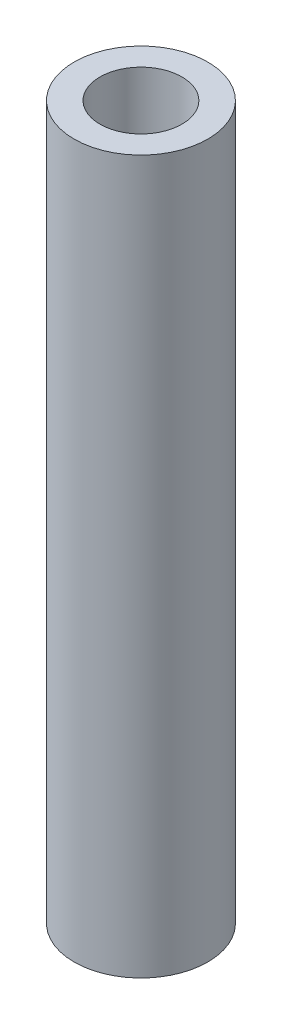
ISO-10303-21;
HEADER;
FILE_DESCRIPTION(('STEP AP214'),'2;1');
FILE_NAME('part.step','',(''),(''),'','','');
FILE_SCHEMA(('AUTOMOTIVE_DESIGN { 1 0 10303 214 1 1 1 1 }'));
ENDSEC;
DATA;
#1=APPLICATION_CONTEXT('core data for automotive mechanical design processes');
#2=APPLICATION_PROTOCOL_DEFINITION('international standard','automotive_design',2000,#1);
#3=PRODUCT_CONTEXT('',#1,'mechanical');
#4=PRODUCT('Part','Part','',(#3));
#5=PRODUCT_RELATED_PRODUCT_CATEGORY('part','',(#4));
#6=PRODUCT_DEFINITION_FORMATION('','',#4);
#7=PRODUCT_DEFINITION_CONTEXT('part definition',#1,'design');
#8=PRODUCT_DEFINITION('design','',#6,#7);
#9=PRODUCT_DEFINITION_SHAPE('','',#8);
#10=(LENGTH_UNIT() NAMED_UNIT(*) SI_UNIT(.MILLI.,.METRE.));
#11=(NAMED_UNIT(*) PLANE_ANGLE_UNIT() SI_UNIT($,.RADIAN.));
#12=(NAMED_UNIT(*) SI_UNIT($,.STERADIAN.) SOLID_ANGLE_UNIT());
#13=UNCERTAINTY_MEASURE_WITH_UNIT(LENGTH_MEASURE(1.E-05),#10,'distance_accuracy_value','');
#14=(GEOMETRIC_REPRESENTATION_CONTEXT(3) GLOBAL_UNCERTAINTY_ASSIGNED_CONTEXT((#13)) GLOBAL_UNIT_ASSIGNED_CONTEXT((#10,
#11,#12)) REPRESENTATION_CONTEXT('',''));
#15=CARTESIAN_POINT('',(0.,0.,0.));
#16=DIRECTION('',(0.,0.,1.));
#17=DIRECTION('',(1.,0.,0.));
#18=AXIS2_PLACEMENT_3D('',#15,#16,#17);
#19=CARTESIAN_POINT('',(0.,25.4,0.));
#20=DIRECTION('',(0.,1.,0.));
#21=DIRECTION('',(0.,0.,1.));
#22=AXIS2_PLACEMENT_3D('',#19,#20,#21);
#23=PLANE('',#22);
#24=CARTESIAN_POINT('',(0.,25.4,0.));
#25=DIRECTION('',(0.,1.,0.));
#26=DIRECTION('',(0.,0.,1.));
#27=AXIS2_PLACEMENT_3D('',#24,#25,#26);
#28=CIRCLE('',#27,2.38125);
#29=CARTESIAN_POINT('',(0.,25.4,2.38125));
#30=VERTEX_POINT('',#29);
#31=EDGE_CURVE('E10',#30,#30,#28,.T.);
#32=ORIENTED_EDGE('',*,*,#31,.T.);
#33=EDGE_LOOP('',(#32));
#34=FACE_BOUND('',#33,.T.);
#35=CARTESIAN_POINT('',(0.,25.4,0.));
#36=DIRECTION('',(0.,1.,0.));
#37=DIRECTION('',(0.,0.,1.));
#38=AXIS2_PLACEMENT_3D('',#35,#36,#37);
#39=CIRCLE('',#38,1.4605);
#40=CARTESIAN_POINT('',(0.,25.4,1.4605));
#41=VERTEX_POINT('',#40);
#42=EDGE_CURVE('E51',#41,#41,#39,.T.);
#43=ORIENTED_EDGE('',*,*,#42,.F.);
#44=EDGE_LOOP('',(#43));
#45=FACE_BOUND('',#44,.T.);
#46=ADVANCED_FACE('F39',(#34,#45),#23,.T.);
#47=CARTESIAN_POINT('',(0.,0.,0.));
#48=DIRECTION('',(0.,1.,0.));
#49=DIRECTION('',(0.,0.,1.));
#50=AXIS2_PLACEMENT_3D('',#47,#48,#49);
#51=PLANE('',#50);
#52=CARTESIAN_POINT('',(0.,0.,0.));
#53=DIRECTION('',(0.,1.,0.));
#54=DIRECTION('',(0.,0.,1.));
#55=AXIS2_PLACEMENT_3D('',#52,#53,#54);
#56=CIRCLE('',#55,2.38125);
#57=CARTESIAN_POINT('',(0.,0.,2.38125));
#58=VERTEX_POINT('',#57);
#59=EDGE_CURVE('E43',#58,#58,#56,.T.);
#60=ORIENTED_EDGE('',*,*,#59,.F.);
#61=EDGE_LOOP('',(#60));
#62=FACE_BOUND('',#61,.T.);
#63=CARTESIAN_POINT('',(0.,0.,0.));
#64=DIRECTION('',(0.,1.,0.));
#65=DIRECTION('',(0.,0.,1.));
#66=AXIS2_PLACEMENT_3D('',#63,#64,#65);
#67=CIRCLE('',#66,1.4605);
#68=CARTESIAN_POINT('',(0.,0.,1.4605));
#69=VERTEX_POINT('',#68);
#70=EDGE_CURVE('E53',#69,#69,#67,.T.);
#71=ORIENTED_EDGE('',*,*,#70,.T.);
#72=EDGE_LOOP('',(#71));
#73=FACE_BOUND('',#72,.T.);
#74=ADVANCED_FACE('F63',(#62,#73),#51,.F.);
#75=CARTESIAN_POINT('',(0.,25.4,0.));
#76=DIRECTION('',(0.,-1.,0.));
#77=DIRECTION('',(0.,0.,-1.));
#78=AXIS2_PLACEMENT_3D('',#75,#76,#77);
#79=CYLINDRICAL_SURFACE('',#78,2.38125);
#80=ORIENTED_EDGE('',*,*,#31,.F.);
#81=EDGE_LOOP('',(#80));
#82=FACE_BOUND('',#81,.T.);
#83=ORIENTED_EDGE('',*,*,#59,.T.);
#84=EDGE_LOOP('',(#83));
#85=FACE_BOUND('',#84,.T.);
#86=ADVANCED_FACE('F41',(#82,#85),#79,.T.);
#87=CARTESIAN_POINT('',(0.,25.4,0.));
#88=DIRECTION('',(0.,-1.,0.));
#89=DIRECTION('',(0.,0.,-1.));
#90=AXIS2_PLACEMENT_3D('',#87,#88,#89);
#91=CYLINDRICAL_SURFACE('',#90,1.4605);
#92=ORIENTED_EDGE('',*,*,#42,.T.);
#93=EDGE_LOOP('',(#92));
#94=FACE_BOUND('',#93,.T.);
#95=ORIENTED_EDGE('',*,*,#70,.F.);
#96=EDGE_LOOP('',(#95));
#97=FACE_BOUND('',#96,.T.);
#98=ADVANCED_FACE('F59',(#94,#97),#91,.F.);
#99=CLOSED_SHELL('',(#46,#74,#86,#98));
#100=MANIFOLD_SOLID_BREP('B2',#99);
#101=ADVANCED_BREP_SHAPE_REPRESENTATION('',(#18,#100),#14);
#102=SHAPE_DEFINITION_REPRESENTATION(#9,#101);
ENDSEC;
END-ISO-10303-21;
